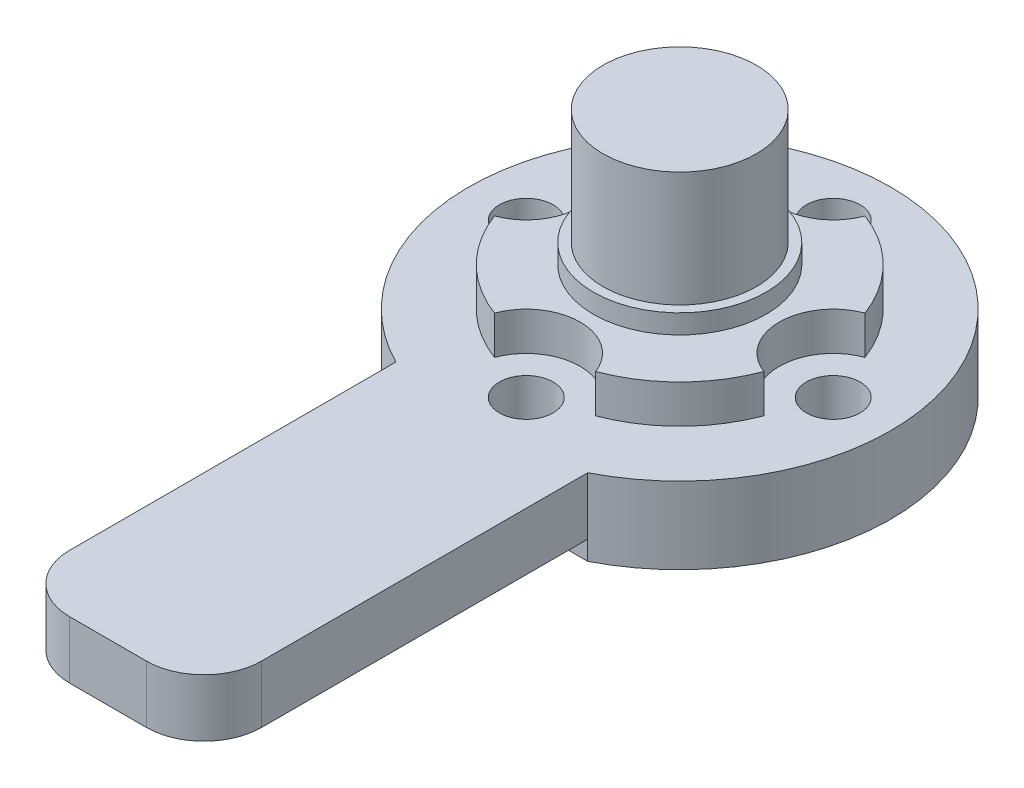
ISO-10303-21;
HEADER;
FILE_DESCRIPTION(('STEP AP214'),'2;1');
FILE_NAME('part.step','',(''),(''),'','','');
FILE_SCHEMA(('AUTOMOTIVE_DESIGN { 1 0 10303 214 1 1 1 1 }'));
ENDSEC;
DATA;
#1=APPLICATION_CONTEXT('core data for automotive mechanical design processes');
#2=APPLICATION_PROTOCOL_DEFINITION('international standard','automotive_design',2000,#1);
#3=PRODUCT_CONTEXT('',#1,'mechanical');
#4=PRODUCT('Part','Part','',(#3));
#5=PRODUCT_RELATED_PRODUCT_CATEGORY('part','',(#4));
#6=PRODUCT_DEFINITION_FORMATION('','',#4);
#7=PRODUCT_DEFINITION_CONTEXT('part definition',#1,'design');
#8=PRODUCT_DEFINITION('design','',#6,#7);
#9=PRODUCT_DEFINITION_SHAPE('','',#8);
#10=(LENGTH_UNIT() NAMED_UNIT(*) SI_UNIT(.MILLI.,.METRE.));
#11=(NAMED_UNIT(*) PLANE_ANGLE_UNIT() SI_UNIT($,.RADIAN.));
#12=(NAMED_UNIT(*) SI_UNIT($,.STERADIAN.) SOLID_ANGLE_UNIT());
#13=UNCERTAINTY_MEASURE_WITH_UNIT(LENGTH_MEASURE(1.E-05),#10,'distance_accuracy_value','');
#14=(GEOMETRIC_REPRESENTATION_CONTEXT(3) GLOBAL_UNCERTAINTY_ASSIGNED_CONTEXT((#13)) GLOBAL_UNIT_ASSIGNED_CONTEXT((#10,
#11,#12)) REPRESENTATION_CONTEXT('',''));
#15=CARTESIAN_POINT('',(0.,0.,0.));
#16=DIRECTION('',(0.,0.,1.));
#17=DIRECTION('',(1.,0.,0.));
#18=AXIS2_PLACEMENT_3D('',#15,#16,#17);
#19=CARTESIAN_POINT('',(0.,4.,0.));
#20=DIRECTION('',(0.,-1.,0.));
#21=DIRECTION('',(0.,0.,-1.));
#22=AXIS2_PLACEMENT_3D('',#19,#20,#21);
#23=CYLINDRICAL_SURFACE('',#22,11.);
#24=DIRECTION('',(0.,-1.,0.));
#25=VECTOR('',#24,1.);
#26=CARTESIAN_POINT('',(5.,26.3606797749979,9.79795897113271));
#27=LINE('',#26,#25);
#28=CARTESIAN_POINT('',(5.,4.,9.79795897113271));
#29=VERTEX_POINT('',#28);
#30=CARTESIAN_POINT('',(5.,1.,9.79795897113271));
#31=VERTEX_POINT('',#30);
#32=EDGE_CURVE('E227',#29,#31,#27,.T.);
#33=ORIENTED_EDGE('',*,*,#32,.T.);
#34=DIRECTION('',(0.,-1.,0.));
#35=VECTOR('',#34,1.);
#36=CARTESIAN_POINT('',(5.,26.3606797749979,9.79795897113271));
#37=LINE('',#36,#35);
#38=CARTESIAN_POINT('',(5.,0.,9.79795897113271));
#39=VERTEX_POINT('',#38);
#40=EDGE_CURVE('E164',#31,#39,#37,.T.);
#41=ORIENTED_EDGE('',*,*,#40,.T.);
#42=CARTESIAN_POINT('',(0.,0.,0.));
#43=DIRECTION('',(0.,1.,0.));
#44=DIRECTION('',(0.,0.,1.));
#45=AXIS2_PLACEMENT_3D('',#42,#43,#44);
#46=CIRCLE('',#45,11.);
#47=CARTESIAN_POINT('',(-5.,0.,9.79795897113271));
#48=VERTEX_POINT('',#47);
#49=EDGE_CURVE('E161',#39,#48,#46,.T.);
#50=ORIENTED_EDGE('',*,*,#49,.T.);
#51=DIRECTION('',(0.,-1.,0.));
#52=VECTOR('',#51,1.);
#53=CARTESIAN_POINT('',(-5.,0.,9.79795897113271));
#54=LINE('',#53,#52);
#55=CARTESIAN_POINT('',(-5.,1.,9.79795897113271));
#56=VERTEX_POINT('',#55);
#57=EDGE_CURVE('E143',#56,#48,#54,.T.);
#58=ORIENTED_EDGE('',*,*,#57,.F.);
#59=DIRECTION('',(0.,-1.,0.));
#60=VECTOR('',#59,1.);
#61=CARTESIAN_POINT('',(-5.,26.3606797749979,9.79795897113271));
#62=LINE('',#61,#60);
#63=CARTESIAN_POINT('',(-5.,4.00000000000001,9.79795897113271));
#64=VERTEX_POINT('',#63);
#65=EDGE_CURVE('E241',#64,#56,#62,.T.);
#66=ORIENTED_EDGE('',*,*,#65,.F.);
#67=CARTESIAN_POINT('',(0.,4.,0.));
#68=DIRECTION('',(0.,1.,0.));
#69=DIRECTION('',(0.,0.,1.));
#70=AXIS2_PLACEMENT_3D('',#67,#68,#69);
#71=CIRCLE('',#70,11.);
#72=EDGE_CURVE('E165',#29,#64,#71,.T.);
#73=ORIENTED_EDGE('',*,*,#72,.F.);
#74=EDGE_LOOP('',(#33,#41,#50,#58,#66,#73));
#75=FACE_BOUND('',#74,.T.);
#76=ADVANCED_FACE('F35',(#75),#23,.T.);
#77=CARTESIAN_POINT('',(0.,13.,0.));
#78=DIRECTION('',(0.,-1.,0.));
#79=DIRECTION('',(0.,0.,-1.));
#80=AXIS2_PLACEMENT_3D('',#77,#78,#79);
#81=CYLINDRICAL_SURFACE('',#80,4.5);
#82=CARTESIAN_POINT('',(0.,6.,0.));
#83=DIRECTION('',(0.,1.,0.));
#84=DIRECTION('',(0.,0.,1.));
#85=AXIS2_PLACEMENT_3D('',#82,#83,#84);
#86=CIRCLE('',#85,4.5);
#87=CARTESIAN_POINT('',(0.,6.,4.5));
#88=VERTEX_POINT('',#87);
#89=EDGE_CURVE('E260',#88,#88,#86,.T.);
#90=ORIENTED_EDGE('',*,*,#89,.T.);
#91=EDGE_LOOP('',(#90));
#92=FACE_BOUND('',#91,.T.);
#93=CARTESIAN_POINT('',(0.,7.,0.));
#94=DIRECTION('',(0.,1.,0.));
#95=DIRECTION('',(0.,0.,1.));
#96=AXIS2_PLACEMENT_3D('',#93,#94,#95);
#97=CIRCLE('',#96,4.5);
#98=CARTESIAN_POINT('',(0.,7.,4.5));
#99=VERTEX_POINT('',#98);
#100=EDGE_CURVE('E255',#99,#99,#97,.T.);
#101=ORIENTED_EDGE('',*,*,#100,.F.);
#102=EDGE_LOOP('',(#101));
#103=FACE_BOUND('',#102,.T.);
#104=ADVANCED_FACE('F338',(#92,#103),#81,.T.);
#105=CARTESIAN_POINT('',(0.,6.,0.));
#106=DIRECTION('',(0.,-1.,0.));
#107=DIRECTION('',(0.,0.,-1.));
#108=AXIS2_PLACEMENT_3D('',#105,#106,#107);
#109=CYLINDRICAL_SURFACE('',#108,7.5);
#110=CARTESIAN_POINT('',(0.,4.,0.));
#111=DIRECTION('',(0.,1.,0.));
#112=DIRECTION('',(0.,0.,1.));
#113=AXIS2_PLACEMENT_3D('',#110,#111,#112);
#114=CIRCLE('',#113,7.5);
#115=CARTESIAN_POINT('',(-7.02171935734293,4.,2.63542354598187));
#116=VERTEX_POINT('',#115);
#117=CARTESIAN_POINT('',(-2.6354235459799,4.,7.02171935734367));
#118=VERTEX_POINT('',#117);
#119=EDGE_CURVE('E169',#116,#118,#114,.T.);
#120=ORIENTED_EDGE('',*,*,#119,.T.);
#121=DIRECTION('',(0.,1.,0.));
#122=VECTOR('',#121,1.);
#123=CARTESIAN_POINT('',(-2.6354235459799,5.,7.02171935734367));
#124=LINE('',#123,#122);
#125=CARTESIAN_POINT('',(-2.6354235459799,6.,7.02171935734367));
#126=VERTEX_POINT('',#125);
#127=EDGE_CURVE('E197',#118,#126,#124,.T.);
#128=ORIENTED_EDGE('',*,*,#127,.T.);
#129=CARTESIAN_POINT('',(0.,6.,0.));
#130=DIRECTION('',(0.,1.,0.));
#131=DIRECTION('',(0.,0.,1.));
#132=AXIS2_PLACEMENT_3D('',#129,#130,#131);
#133=CIRCLE('',#132,7.5);
#134=CARTESIAN_POINT('',(-7.02171935734293,6.,2.63542354598187));
#135=VERTEX_POINT('',#134);
#136=EDGE_CURVE('E403',#135,#126,#133,.T.);
#137=ORIENTED_EDGE('',*,*,#136,.F.);
#138=DIRECTION('',(0.,1.,0.));
#139=VECTOR('',#138,1.);
#140=CARTESIAN_POINT('',(-7.02171935734293,5.,2.63542354598187));
#141=LINE('',#140,#139);
#142=EDGE_CURVE('E188',#135,#116,#141,.F.);
#143=ORIENTED_EDGE('',*,*,#142,.T.);
#144=EDGE_LOOP('',(#120,#128,#137,#143));
#145=FACE_BOUND('',#144,.T.);
#146=ADVANCED_FACE('F334',(#145),#109,.T.);
#147=CARTESIAN_POINT('',(-2.635423545982,4.,-7.02171935734288));
#148=VERTEX_POINT('',#147);
#149=CARTESIAN_POINT('',(-7.02171935734366,4.,-2.6354235459799));
#150=VERTEX_POINT('',#149);
#151=EDGE_CURVE('E289',#148,#150,#114,.T.);
#152=ORIENTED_EDGE('',*,*,#151,.T.);
#153=DIRECTION('',(0.,1.,0.));
#154=VECTOR('',#153,1.);
#155=CARTESIAN_POINT('',(-7.02171935734366,5.,-2.6354235459799));
#156=LINE('',#155,#154);
#157=CARTESIAN_POINT('',(-7.02171935734366,6.,-2.6354235459799));
#158=VERTEX_POINT('',#157);
#159=EDGE_CURVE('E191',#150,#158,#156,.T.);
#160=ORIENTED_EDGE('',*,*,#159,.T.);
#161=CARTESIAN_POINT('',(-2.635423545982,6.,-7.02171935734288));
#162=VERTEX_POINT('',#161);
#163=EDGE_CURVE('E285',#162,#158,#133,.T.);
#164=ORIENTED_EDGE('',*,*,#163,.F.);
#165=DIRECTION('',(0.,1.,0.));
#166=VECTOR('',#165,1.);
#167=CARTESIAN_POINT('',(-2.635423545982,5.,-7.02171935734288));
#168=LINE('',#167,#166);
#169=EDGE_CURVE('E182',#162,#148,#168,.F.);
#170=ORIENTED_EDGE('',*,*,#169,.T.);
#171=EDGE_LOOP('',(#152,#160,#164,#170));
#172=FACE_BOUND('',#171,.T.);
#173=ADVANCED_FACE('F411',(#172),#109,.T.);
#174=CARTESIAN_POINT('',(7.02171935734302,4.,-2.63542354598162));
#175=VERTEX_POINT('',#174);
#176=CARTESIAN_POINT('',(2.63542354598041,4.,-7.02171935734347));
#177=VERTEX_POINT('',#176);
#178=EDGE_CURVE('E179',#175,#177,#114,.T.);
#179=ORIENTED_EDGE('',*,*,#178,.T.);
#180=DIRECTION('',(0.,1.,0.));
#181=VECTOR('',#180,1.);
#182=CARTESIAN_POINT('',(2.63542354598041,5.,-7.02171935734347));
#183=LINE('',#182,#181);
#184=CARTESIAN_POINT('',(2.63542354598041,6.,-7.02171935734347));
#185=VERTEX_POINT('',#184);
#186=EDGE_CURVE('E185',#177,#185,#183,.T.);
#187=ORIENTED_EDGE('',*,*,#186,.T.);
#188=CARTESIAN_POINT('',(7.02171935734302,6.,-2.63542354598162));
#189=VERTEX_POINT('',#188);
#190=EDGE_CURVE('E281',#189,#185,#133,.T.);
#191=ORIENTED_EDGE('',*,*,#190,.F.);
#192=DIRECTION('',(0.,1.,0.));
#193=VECTOR('',#192,1.);
#194=CARTESIAN_POINT('',(7.02171935734302,5.,-2.63542354598162));
#195=LINE('',#194,#193);
#196=EDGE_CURVE('E175',#189,#175,#195,.F.);
#197=ORIENTED_EDGE('',*,*,#196,.T.);
#198=EDGE_LOOP('',(#179,#187,#191,#197));
#199=FACE_BOUND('',#198,.T.);
#200=ADVANCED_FACE('F335',(#199),#109,.T.);
#201=CARTESIAN_POINT('',(0.,4.,0.));
#202=DIRECTION('',(0.,1.,0.));
#203=DIRECTION('',(0.,0.,1.));
#204=AXIS2_PLACEMENT_3D('',#201,#202,#203);
#205=PLANE('',#204);
#206=CARTESIAN_POINT('',(2.63542354598148,4.,7.02171935734307));
#207=VERTEX_POINT('',#206);
#208=CARTESIAN_POINT('',(7.02171935734347,4.,2.63542354598042));
#209=VERTEX_POINT('',#208);
#210=EDGE_CURVE('E280',#207,#209,#114,.T.);
#211=ORIENTED_EDGE('',*,*,#210,.F.);
#212=CARTESIAN_POINT('',(9.01899415695745E-13,4.,8.0000000000009));
#213=DIRECTION('',(0.,1.,0.));
#214=DIRECTION('',(0.,0.,1.));
#215=AXIS2_PLACEMENT_3D('',#212,#213,#214);
#216=CIRCLE('',#215,2.81113683098277);
#217=EDGE_CURVE('E266',#118,#207,#216,.F.);
#218=ORIENTED_EDGE('',*,*,#217,.F.);
#219=ORIENTED_EDGE('',*,*,#119,.F.);
#220=CARTESIAN_POINT('',(-8.00000000000068,4.,1.12265752250111E-12));
#221=DIRECTION('',(0.,1.,0.));
#222=DIRECTION('',(0.,0.,1.));
#223=AXIS2_PLACEMENT_3D('',#220,#221,#222);
#224=CIRCLE('',#223,2.81113683098291);
#225=EDGE_CURVE('E267',#150,#116,#224,.F.);
#226=ORIENTED_EDGE('',*,*,#225,.F.);
#227=ORIENTED_EDGE('',*,*,#151,.F.);
#228=CARTESIAN_POINT('',(-9.02879133135063E-13,4.,-8.00000000000046));
#229=DIRECTION('',(0.,1.,0.));
#230=DIRECTION('',(0.,0.,1.));
#231=AXIS2_PLACEMENT_3D('',#228,#229,#230);
#232=CIRCLE('',#231,2.81113683098317);
#233=EDGE_CURVE('E272',#177,#148,#232,.F.);
#234=ORIENTED_EDGE('',*,*,#233,.F.);
#235=ORIENTED_EDGE('',*,*,#178,.F.);
#236=CARTESIAN_POINT('',(8.00000000000068,4.,-6.81141308890378E-13));
#237=DIRECTION('',(0.,1.,0.));
#238=DIRECTION('',(0.,0.,1.));
#239=AXIS2_PLACEMENT_3D('',#236,#237,#238);
#240=CIRCLE('',#239,2.81113683098305);
#241=EDGE_CURVE('E278',#209,#175,#240,.F.);
#242=ORIENTED_EDGE('',*,*,#241,.F.);
#243=EDGE_LOOP('',(#211,#218,#219,#226,#227,#234,#235,#242));
#244=FACE_BOUND('',#243,.T.);
#245=DIRECTION('',(1.,0.,0.));
#246=VECTOR('',#245,1.);
#247=CARTESIAN_POINT('',(0.,4.,29.7979589711327));
#248=LINE('',#247,#246);
#249=CARTESIAN_POINT('',(-2.,4.,29.7979589711327));
#250=VERTEX_POINT('',#249);
#251=CARTESIAN_POINT('',(2.,4.,29.7979589711327));
#252=VERTEX_POINT('',#251);
#253=EDGE_CURVE('E221',#250,#252,#248,.T.);
#254=ORIENTED_EDGE('',*,*,#253,.T.);
#255=CARTESIAN_POINT('',(2.,4.,26.7979589711327));
#256=DIRECTION('',(0.,1.,0.));
#257=DIRECTION('',(0.,0.,1.));
#258=AXIS2_PLACEMENT_3D('',#255,#256,#257);
#259=CIRCLE('',#258,3.);
#260=CARTESIAN_POINT('',(5.,4.,26.7979589711327));
#261=VERTEX_POINT('',#260);
#262=EDGE_CURVE('E43',#252,#261,#259,.T.);
#263=ORIENTED_EDGE('',*,*,#262,.T.);
#264=DIRECTION('',(0.,0.,-1.));
#265=VECTOR('',#264,1.);
#266=CARTESIAN_POINT('',(5.,4.,0.));
#267=LINE('',#266,#265);
#268=EDGE_CURVE('E219',#261,#29,#267,.T.);
#269=ORIENTED_EDGE('',*,*,#268,.T.);
#270=ORIENTED_EDGE('',*,*,#72,.T.);
#271=DIRECTION('',(0.,0.,-1.));
#272=VECTOR('',#271,1.);
#273=CARTESIAN_POINT('',(-5.,4.,0.));
#274=LINE('',#273,#272);
#275=CARTESIAN_POINT('',(-5.,4.,26.7979589711327));
#276=VERTEX_POINT('',#275);
#277=EDGE_CURVE('E247',#276,#64,#274,.T.);
#278=ORIENTED_EDGE('',*,*,#277,.F.);
#279=CARTESIAN_POINT('',(-2.,4.,26.7979589711327));
#280=DIRECTION('',(0.,1.,0.));
#281=DIRECTION('',(0.,0.,1.));
#282=AXIS2_PLACEMENT_3D('',#279,#280,#281);
#283=CIRCLE('',#282,3.);
#284=EDGE_CURVE('E213',#276,#250,#283,.T.);
#285=ORIENTED_EDGE('',*,*,#284,.T.);
#286=EDGE_LOOP('',(#254,#263,#269,#270,#278,#285));
#287=FACE_BOUND('',#286,.T.);
#288=CARTESIAN_POINT('',(8.00000000000068,4.,-6.81141308890378E-13));
#289=DIRECTION('',(0.,1.,0.));
#290=DIRECTION('',(0.,0.,1.));
#291=AXIS2_PLACEMENT_3D('',#288,#289,#290);
#292=CIRCLE('',#291,1.4000000000008);
#293=CARTESIAN_POINT('',(8.00000000000068,4.,1.40000000000012));
#294=VERTEX_POINT('',#293);
#295=EDGE_CURVE('E294',#294,#294,#292,.T.);
#296=ORIENTED_EDGE('',*,*,#295,.F.);
#297=EDGE_LOOP('',(#296));
#298=FACE_BOUND('',#297,.T.);
#299=CARTESIAN_POINT('',(0.,4.,-8.));
#300=DIRECTION('',(0.,1.,0.));
#301=DIRECTION('',(0.,0.,1.));
#302=AXIS2_PLACEMENT_3D('',#299,#300,#301);
#303=CIRCLE('',#302,1.4);
#304=CARTESIAN_POINT('',(0.,4.,-6.6));
#305=VERTEX_POINT('',#304);
#306=EDGE_CURVE('E293',#305,#305,#303,.T.);
#307=ORIENTED_EDGE('',*,*,#306,.F.);
#308=EDGE_LOOP('',(#307));
#309=FACE_BOUND('',#308,.T.);
#310=CARTESIAN_POINT('',(-7.99999999999932,4.,6.82121026329696E-13));
#311=DIRECTION('',(0.,1.,0.));
#312=DIRECTION('',(0.,0.,1.));
#313=AXIS2_PLACEMENT_3D('',#310,#311,#312);
#314=CIRCLE('',#313,1.40000000000146);
#315=CARTESIAN_POINT('',(-7.99999999999932,4.,1.40000000000214));
#316=VERTEX_POINT('',#315);
#317=EDGE_CURVE('E306',#316,#316,#314,.T.);
#318=ORIENTED_EDGE('',*,*,#317,.F.);
#319=EDGE_LOOP('',(#318));
#320=FACE_BOUND('',#319,.T.);
#321=CARTESIAN_POINT('',(1.36228261778076E-12,4.,8.));
#322=DIRECTION('',(0.,1.,0.));
#323=DIRECTION('',(0.,0.,1.));
#324=AXIS2_PLACEMENT_3D('',#321,#322,#323);
#325=CIRCLE('',#324,1.40000000000193);
#326=CARTESIAN_POINT('',(1.36228261778076E-12,4.,9.40000000000193));
#327=VERTEX_POINT('',#326);
#328=EDGE_CURVE('E300',#327,#327,#325,.T.);
#329=ORIENTED_EDGE('',*,*,#328,.F.);
#330=EDGE_LOOP('',(#329));
#331=FACE_BOUND('',#330,.T.);
#332=ADVANCED_FACE('F217',(#244,#287,#298,#309,#320,#331),#205,.T.);
#333=CARTESIAN_POINT('',(0.,0.,0.));
#334=DIRECTION('',(0.,1.,0.));
#335=DIRECTION('',(0.,0.,1.));
#336=AXIS2_PLACEMENT_3D('',#333,#334,#335);
#337=PLANE('',#336);
#338=CARTESIAN_POINT('',(8.00000000000068,0.,-6.81141308890378E-13));
#339=DIRECTION('',(0.,1.,0.));
#340=DIRECTION('',(0.,0.,1.));
#341=AXIS2_PLACEMENT_3D('',#338,#339,#340);
#342=CIRCLE('',#341,1.4000000000008);
#343=CARTESIAN_POINT('',(8.00000000000068,0.,1.40000000000012));
#344=VERTEX_POINT('',#343);
#345=EDGE_CURVE('E290',#344,#344,#342,.T.);
#346=ORIENTED_EDGE('',*,*,#345,.T.);
#347=EDGE_LOOP('',(#346));
#348=FACE_BOUND('',#347,.T.);
#349=CARTESIAN_POINT('',(1.36228261778076E-12,0.,8.));
#350=DIRECTION('',(0.,1.,0.));
#351=DIRECTION('',(0.,0.,1.));
#352=AXIS2_PLACEMENT_3D('',#349,#350,#351);
#353=CIRCLE('',#352,1.40000000000193);
#354=CARTESIAN_POINT('',(1.36228261778076E-12,0.,9.40000000000193));
#355=VERTEX_POINT('',#354);
#356=EDGE_CURVE('E297',#355,#355,#353,.T.);
#357=ORIENTED_EDGE('',*,*,#356,.T.);
#358=EDGE_LOOP('',(#357));
#359=FACE_BOUND('',#358,.T.);
#360=CARTESIAN_POINT('',(-7.99999999999932,0.,6.82121026329696E-13));
#361=DIRECTION('',(0.,1.,0.));
#362=DIRECTION('',(0.,0.,1.));
#363=AXIS2_PLACEMENT_3D('',#360,#361,#362);
#364=CIRCLE('',#363,1.40000000000146);
#365=CARTESIAN_POINT('',(-7.99999999999932,0.,1.40000000000214));
#366=VERTEX_POINT('',#365);
#367=EDGE_CURVE('E303',#366,#366,#364,.T.);
#368=ORIENTED_EDGE('',*,*,#367,.T.);
#369=EDGE_LOOP('',(#368));
#370=FACE_BOUND('',#369,.T.);
#371=CARTESIAN_POINT('',(0.,0.,-8.));
#372=DIRECTION('',(0.,1.,0.));
#373=DIRECTION('',(0.,0.,1.));
#374=AXIS2_PLACEMENT_3D('',#371,#372,#373);
#375=CIRCLE('',#374,1.4);
#376=CARTESIAN_POINT('',(0.,0.,-6.6));
#377=VERTEX_POINT('',#376);
#378=EDGE_CURVE('E172',#377,#377,#375,.T.);
#379=ORIENTED_EDGE('',*,*,#378,.T.);
#380=EDGE_LOOP('',(#379));
#381=FACE_BOUND('',#380,.T.);
#382=ORIENTED_EDGE('',*,*,#49,.F.);
#383=DIRECTION('',(-1.,0.,0.));
#384=VECTOR('',#383,1.);
#385=CARTESIAN_POINT('',(11.,0.,9.79795897113271));
#386=LINE('',#385,#384);
#387=EDGE_CURVE('E147',#39,#48,#386,.T.);
#388=ORIENTED_EDGE('',*,*,#387,.T.);
#389=EDGE_LOOP('',(#382,#388));
#390=FACE_BOUND('',#389,.T.);
#391=CARTESIAN_POINT('',(0.,0.,0.));
#392=DIRECTION('',(0.,1.,0.));
#393=DIRECTION('',(0.,0.,1.));
#394=AXIS2_PLACEMENT_3D('',#391,#392,#393);
#395=CIRCLE('',#394,4.25);
#396=CARTESIAN_POINT('',(0.,0.,4.25));
#397=VERTEX_POINT('',#396);
#398=EDGE_CURVE('E166',#397,#397,#395,.T.);
#399=ORIENTED_EDGE('',*,*,#398,.T.);
#400=EDGE_LOOP('',(#399));
#401=FACE_BOUND('',#400,.T.);
#402=ADVANCED_FACE('F159',(#348,#359,#370,#381,#390,#401),#337,.F.);
#403=CARTESIAN_POINT('',(0.,4.,0.));
#404=DIRECTION('',(0.,-1.,0.));
#405=DIRECTION('',(0.,0.,-1.));
#406=AXIS2_PLACEMENT_3D('',#403,#404,#405);
#407=CYLINDRICAL_SURFACE('',#406,4.25);
#408=CARTESIAN_POINT('',(0.,4.,0.));
#409=DIRECTION('',(0.,1.,0.));
#410=DIRECTION('',(0.,0.,1.));
#411=AXIS2_PLACEMENT_3D('',#408,#409,#410);
#412=CIRCLE('',#411,4.25);
#413=CARTESIAN_POINT('',(0.,4.,4.25));
#414=VERTEX_POINT('',#413);
#415=EDGE_CURVE('E284',#414,#414,#412,.T.);
#416=ORIENTED_EDGE('',*,*,#415,.T.);
#417=EDGE_LOOP('',(#416));
#418=FACE_BOUND('',#417,.T.);
#419=ORIENTED_EDGE('',*,*,#398,.F.);
#420=EDGE_LOOP('',(#419));
#421=FACE_BOUND('',#420,.T.);
#422=ADVANCED_FACE('F316',(#418,#421),#407,.F.);
#423=CARTESIAN_POINT('',(0.,0.,-8.));
#424=DIRECTION('',(0.,1.,0.));
#425=DIRECTION('',(0.,0.,1.));
#426=AXIS2_PLACEMENT_3D('',#423,#424,#425);
#427=CYLINDRICAL_SURFACE('',#426,1.4);
#428=ORIENTED_EDGE('',*,*,#378,.F.);
#429=EDGE_LOOP('',(#428));
#430=FACE_BOUND('',#429,.T.);
#431=ORIENTED_EDGE('',*,*,#306,.T.);
#432=EDGE_LOOP('',(#431));
#433=FACE_BOUND('',#432,.T.);
#434=ADVANCED_FACE('F436',(#430,#433),#427,.F.);
#435=CARTESIAN_POINT('',(-7.99999999999932,0.,6.82121026329696E-13));
#436=DIRECTION('',(0.,1.,0.));
#437=DIRECTION('',(0.,0.,1.));
#438=AXIS2_PLACEMENT_3D('',#435,#436,#437);
#439=CYLINDRICAL_SURFACE('',#438,1.40000000000146);
#440=ORIENTED_EDGE('',*,*,#367,.F.);
#441=EDGE_LOOP('',(#440));
#442=FACE_BOUND('',#441,.T.);
#443=ORIENTED_EDGE('',*,*,#317,.T.);
#444=EDGE_LOOP('',(#443));
#445=FACE_BOUND('',#444,.T.);
#446=ADVANCED_FACE('F432',(#442,#445),#439,.F.);
#447=CARTESIAN_POINT('',(1.36228261778076E-12,0.,8.));
#448=DIRECTION('',(0.,1.,0.));
#449=DIRECTION('',(0.,0.,1.));
#450=AXIS2_PLACEMENT_3D('',#447,#448,#449);
#451=CYLINDRICAL_SURFACE('',#450,1.40000000000193);
#452=ORIENTED_EDGE('',*,*,#356,.F.);
#453=EDGE_LOOP('',(#452));
#454=FACE_BOUND('',#453,.T.);
#455=ORIENTED_EDGE('',*,*,#328,.T.);
#456=EDGE_LOOP('',(#455));
#457=FACE_BOUND('',#456,.T.);
#458=ADVANCED_FACE('F392',(#454,#457),#451,.F.);
#459=CARTESIAN_POINT('',(8.00000000000068,0.,-6.81141308890378E-13));
#460=DIRECTION('',(0.,1.,0.));
#461=DIRECTION('',(0.,0.,1.));
#462=AXIS2_PLACEMENT_3D('',#459,#460,#461);
#463=CYLINDRICAL_SURFACE('',#462,1.4000000000008);
#464=ORIENTED_EDGE('',*,*,#345,.F.);
#465=EDGE_LOOP('',(#464));
#466=FACE_BOUND('',#465,.T.);
#467=ORIENTED_EDGE('',*,*,#295,.T.);
#468=EDGE_LOOP('',(#467));
#469=FACE_BOUND('',#468,.T.);
#470=ADVANCED_FACE('F387',(#466,#469),#463,.F.);
#471=CARTESIAN_POINT('',(0.,6.,0.));
#472=DIRECTION('',(0.,1.,0.));
#473=DIRECTION('',(0.,0.,1.));
#474=AXIS2_PLACEMENT_3D('',#471,#472,#473);
#475=PLANE('',#474);
#476=ORIENTED_EDGE('',*,*,#89,.F.);
#477=EDGE_LOOP('',(#476));
#478=FACE_BOUND('',#477,.T.);
#479=CARTESIAN_POINT('',(9.01899415695745E-13,6.,8.0000000000009));
#480=DIRECTION('',(0.,1.,0.));
#481=DIRECTION('',(0.,0.,1.));
#482=AXIS2_PLACEMENT_3D('',#479,#480,#481);
#483=CIRCLE('',#482,2.81113683098277);
#484=CARTESIAN_POINT('',(2.63542354598148,6.,7.02171935734307));
#485=VERTEX_POINT('',#484);
#486=EDGE_CURVE('E264',#485,#126,#483,.T.);
#487=ORIENTED_EDGE('',*,*,#486,.F.);
#488=CARTESIAN_POINT('',(7.02171935734347,6.,2.63542354598042));
#489=VERTEX_POINT('',#488);
#490=EDGE_CURVE('E286',#485,#489,#133,.T.);
#491=ORIENTED_EDGE('',*,*,#490,.T.);
#492=CARTESIAN_POINT('',(8.00000000000068,6.,-6.81141308890378E-13));
#493=DIRECTION('',(0.,1.,0.));
#494=DIRECTION('',(0.,0.,1.));
#495=AXIS2_PLACEMENT_3D('',#492,#493,#494);
#496=CIRCLE('',#495,2.81113683098305);
#497=EDGE_CURVE('E269',#189,#489,#496,.T.);
#498=ORIENTED_EDGE('',*,*,#497,.F.);
#499=ORIENTED_EDGE('',*,*,#190,.T.);
#500=CARTESIAN_POINT('',(-9.02879133135063E-13,6.,-8.00000000000046));
#501=DIRECTION('',(0.,1.,0.));
#502=DIRECTION('',(0.,0.,1.));
#503=AXIS2_PLACEMENT_3D('',#500,#501,#502);
#504=CIRCLE('',#503,2.81113683098317);
#505=EDGE_CURVE('E263',#162,#185,#504,.T.);
#506=ORIENTED_EDGE('',*,*,#505,.F.);
#507=ORIENTED_EDGE('',*,*,#163,.T.);
#508=CARTESIAN_POINT('',(-8.00000000000068,6.,1.12265752250111E-12));
#509=DIRECTION('',(0.,1.,0.));
#510=DIRECTION('',(0.,0.,1.));
#511=AXIS2_PLACEMENT_3D('',#508,#509,#510);
#512=CIRCLE('',#511,2.81113683098291);
#513=EDGE_CURVE('E270',#135,#158,#512,.T.);
#514=ORIENTED_EDGE('',*,*,#513,.F.);
#515=ORIENTED_EDGE('',*,*,#136,.T.);
#516=EDGE_LOOP('',(#487,#491,#498,#499,#506,#507,#514,#515));
#517=FACE_BOUND('',#516,.T.);
#518=ADVANCED_FACE('F331',(#478,#517),#475,.T.);
#519=ORIENTED_EDGE('',*,*,#490,.F.);
#520=DIRECTION('',(0.,1.,0.));
#521=VECTOR('',#520,1.);
#522=CARTESIAN_POINT('',(2.63542354598148,5.,7.02171935734307));
#523=LINE('',#522,#521);
#524=EDGE_CURVE('E194',#485,#207,#523,.F.);
#525=ORIENTED_EDGE('',*,*,#524,.T.);
#526=ORIENTED_EDGE('',*,*,#210,.T.);
#527=DIRECTION('',(0.,1.,0.));
#528=VECTOR('',#527,1.);
#529=CARTESIAN_POINT('',(7.02171935734347,5.,2.63542354598042));
#530=LINE('',#529,#528);
#531=EDGE_CURVE('E178',#209,#489,#530,.T.);
#532=ORIENTED_EDGE('',*,*,#531,.T.);
#533=EDGE_LOOP('',(#519,#525,#526,#532));
#534=FACE_BOUND('',#533,.T.);
#535=ADVANCED_FACE('F322',(#534),#109,.T.);
#536=CARTESIAN_POINT('',(0.,4.,0.));
#537=DIRECTION('',(0.,1.,0.));
#538=DIRECTION('',(0.,0.,1.));
#539=AXIS2_PLACEMENT_3D('',#536,#537,#538);
#540=PLANE('',#539);
#541=ORIENTED_EDGE('',*,*,#415,.F.);
#542=EDGE_LOOP('',(#541));
#543=FACE_BOUND('',#542,.T.);
#544=ADVANCED_FACE('F319',(#543),#540,.F.);
#545=CARTESIAN_POINT('',(8.00000000000068,-3.95109566412585,-6.81141308890378E-13));
#546=DIRECTION('',(0.,1.,0.));
#547=DIRECTION('',(0.,0.,1.));
#548=AXIS2_PLACEMENT_3D('',#545,#546,#547);
#549=CYLINDRICAL_SURFACE('',#548,2.81113683098305);
#550=ORIENTED_EDGE('',*,*,#241,.T.);
#551=ORIENTED_EDGE('',*,*,#196,.F.);
#552=ORIENTED_EDGE('',*,*,#497,.T.);
#553=ORIENTED_EDGE('',*,*,#531,.F.);
#554=EDGE_LOOP('',(#550,#551,#552,#553));
#555=FACE_BOUND('',#554,.T.);
#556=ADVANCED_FACE('F321',(#555),#549,.F.);
#557=CARTESIAN_POINT('',(-9.02879133135063E-13,-3.95109566412585,-8.00000000000046));
#558=DIRECTION('',(0.,1.,0.));
#559=DIRECTION('',(0.,0.,1.));
#560=AXIS2_PLACEMENT_3D('',#557,#558,#559);
#561=CYLINDRICAL_SURFACE('',#560,2.81113683098317);
#562=ORIENTED_EDGE('',*,*,#233,.T.);
#563=ORIENTED_EDGE('',*,*,#169,.F.);
#564=ORIENTED_EDGE('',*,*,#505,.T.);
#565=ORIENTED_EDGE('',*,*,#186,.F.);
#566=EDGE_LOOP('',(#562,#563,#564,#565));
#567=FACE_BOUND('',#566,.T.);
#568=ADVANCED_FACE('F328',(#567),#561,.F.);
#569=CARTESIAN_POINT('',(-8.00000000000068,-3.95109566412585,1.12265752250111E-12));
#570=DIRECTION('',(0.,1.,0.));
#571=DIRECTION('',(0.,0.,1.));
#572=AXIS2_PLACEMENT_3D('',#569,#570,#571);
#573=CYLINDRICAL_SURFACE('',#572,2.81113683098291);
#574=ORIENTED_EDGE('',*,*,#225,.T.);
#575=ORIENTED_EDGE('',*,*,#142,.F.);
#576=ORIENTED_EDGE('',*,*,#513,.T.);
#577=ORIENTED_EDGE('',*,*,#159,.F.);
#578=EDGE_LOOP('',(#574,#575,#576,#577));
#579=FACE_BOUND('',#578,.T.);
#580=ADVANCED_FACE('F379',(#579),#573,.F.);
#581=CARTESIAN_POINT('',(9.01899415695745E-13,-3.95109566412585,8.0000000000009));
#582=DIRECTION('',(0.,1.,0.));
#583=DIRECTION('',(0.,0.,1.));
#584=AXIS2_PLACEMENT_3D('',#581,#582,#583);
#585=CYLINDRICAL_SURFACE('',#584,2.81113683098277);
#586=ORIENTED_EDGE('',*,*,#217,.T.);
#587=ORIENTED_EDGE('',*,*,#524,.F.);
#588=ORIENTED_EDGE('',*,*,#486,.T.);
#589=ORIENTED_EDGE('',*,*,#127,.F.);
#590=EDGE_LOOP('',(#586,#587,#588,#589));
#591=FACE_BOUND('',#590,.T.);
#592=ADVANCED_FACE('F372',(#591),#585,.F.);
#593=CARTESIAN_POINT('',(0.,7.,0.));
#594=DIRECTION('',(0.,1.,0.));
#595=DIRECTION('',(0.,0.,1.));
#596=AXIS2_PLACEMENT_3D('',#593,#594,#595);
#597=PLANE('',#596);
#598=CARTESIAN_POINT('',(0.,7.,0.));
#599=DIRECTION('',(0.,1.,0.));
#600=DIRECTION('',(0.,0.,1.));
#601=AXIS2_PLACEMENT_3D('',#598,#599,#600);
#602=CIRCLE('',#601,4.);
#603=CARTESIAN_POINT('',(0.,7.,4.));
#604=VERTEX_POINT('',#603);
#605=EDGE_CURVE('E252',#604,#604,#602,.T.);
#606=ORIENTED_EDGE('',*,*,#605,.F.);
#607=EDGE_LOOP('',(#606));
#608=FACE_BOUND('',#607,.T.);
#609=ORIENTED_EDGE('',*,*,#100,.T.);
#610=EDGE_LOOP('',(#609));
#611=FACE_BOUND('',#610,.T.);
#612=ADVANCED_FACE('F368',(#608,#611),#597,.T.);
#613=CARTESIAN_POINT('',(0.,7.,0.));
#614=DIRECTION('',(0.,1.,0.));
#615=DIRECTION('',(0.,0.,1.));
#616=AXIS2_PLACEMENT_3D('',#613,#614,#615);
#617=CYLINDRICAL_SURFACE('',#616,4.);
#618=ORIENTED_EDGE('',*,*,#605,.T.);
#619=EDGE_LOOP('',(#618));
#620=FACE_BOUND('',#619,.T.);
#621=CARTESIAN_POINT('',(0.,13.,0.));
#622=DIRECTION('',(0.,1.,0.));
#623=DIRECTION('',(0.,0.,1.));
#624=AXIS2_PLACEMENT_3D('',#621,#622,#623);
#625=CIRCLE('',#624,4.);
#626=CARTESIAN_POINT('',(0.,13.,4.));
#627=VERTEX_POINT('',#626);
#628=EDGE_CURVE('E229',#627,#627,#625,.T.);
#629=ORIENTED_EDGE('',*,*,#628,.F.);
#630=EDGE_LOOP('',(#629));
#631=FACE_BOUND('',#630,.T.);
#632=ADVANCED_FACE('F365',(#620,#631),#617,.T.);
#633=CARTESIAN_POINT('',(0.,13.,0.));
#634=DIRECTION('',(0.,1.,0.));
#635=DIRECTION('',(0.,0.,1.));
#636=AXIS2_PLACEMENT_3D('',#633,#634,#635);
#637=PLANE('',#636);
#638=ORIENTED_EDGE('',*,*,#628,.T.);
#639=EDGE_LOOP('',(#638));
#640=FACE_BOUND('',#639,.T.);
#641=ADVANCED_FACE('F364',(#640),#637,.T.);
#642=CARTESIAN_POINT('',(5.,26.3606797749979,0.));
#643=DIRECTION('',(-1.,0.,0.));
#644=DIRECTION('',(0.,0.,1.));
#645=AXIS2_PLACEMENT_3D('',#642,#643,#644);
#646=PLANE('',#645);
#647=ORIENTED_EDGE('',*,*,#268,.F.);
#648=DIRECTION('',(0.,-1.,0.));
#649=VECTOR('',#648,1.);
#650=CARTESIAN_POINT('',(5.,26.3606797749979,26.7979589711327));
#651=LINE('',#650,#649);
#652=CARTESIAN_POINT('',(5.,1.,26.7979589711327));
#653=VERTEX_POINT('',#652);
#654=EDGE_CURVE('E202',#261,#653,#651,.T.);
#655=ORIENTED_EDGE('',*,*,#654,.T.);
#656=DIRECTION('',(0.,0.,-1.));
#657=VECTOR('',#656,1.);
#658=CARTESIAN_POINT('',(5.,1.,0.));
#659=LINE('',#658,#657);
#660=EDGE_CURVE('E235',#653,#31,#659,.T.);
#661=ORIENTED_EDGE('',*,*,#660,.T.);
#662=ORIENTED_EDGE('',*,*,#32,.F.);
#663=EDGE_LOOP('',(#647,#655,#661,#662));
#664=FACE_BOUND('',#663,.T.);
#665=ADVANCED_FACE('F225',(#664),#646,.F.);
#666=CARTESIAN_POINT('',(-5.,26.3606797749979,0.));
#667=DIRECTION('',(-1.,0.,0.));
#668=DIRECTION('',(0.,0.,1.));
#669=AXIS2_PLACEMENT_3D('',#666,#667,#668);
#670=PLANE('',#669);
#671=DIRECTION('',(0.,0.,-1.));
#672=VECTOR('',#671,1.);
#673=CARTESIAN_POINT('',(-5.,1.,9.79795897113271));
#674=LINE('',#673,#672);
#675=CARTESIAN_POINT('',(-5.,1.,26.7979589711327));
#676=VERTEX_POINT('',#675);
#677=EDGE_CURVE('E155',#676,#56,#674,.T.);
#678=ORIENTED_EDGE('',*,*,#677,.F.);
#679=DIRECTION('',(0.,-1.,0.));
#680=VECTOR('',#679,1.);
#681=CARTESIAN_POINT('',(-5.,4.00000000000001,26.7979589711327));
#682=LINE('',#681,#680);
#683=EDGE_CURVE('E11',#676,#276,#682,.F.);
#684=ORIENTED_EDGE('',*,*,#683,.T.);
#685=ORIENTED_EDGE('',*,*,#277,.T.);
#686=ORIENTED_EDGE('',*,*,#65,.T.);
#687=EDGE_LOOP('',(#678,#684,#685,#686));
#688=FACE_BOUND('',#687,.T.);
#689=ADVANCED_FACE('F240',(#688),#670,.T.);
#690=CARTESIAN_POINT('',(0.,26.3606797749979,29.7979589711327));
#691=DIRECTION('',(0.,0.,-1.));
#692=DIRECTION('',(-1.,0.,0.));
#693=AXIS2_PLACEMENT_3D('',#690,#691,#692);
#694=PLANE('',#693);
#695=DIRECTION('',(1.,0.,0.));
#696=VECTOR('',#695,1.);
#697=CARTESIAN_POINT('',(0.,1.,29.7979589711327));
#698=LINE('',#697,#696);
#699=CARTESIAN_POINT('',(-2.,1.,29.7979589711327));
#700=VERTEX_POINT('',#699);
#701=CARTESIAN_POINT('',(2.,1.,29.7979589711327));
#702=VERTEX_POINT('',#701);
#703=EDGE_CURVE('E200',#700,#702,#698,.T.);
#704=ORIENTED_EDGE('',*,*,#703,.T.);
#705=DIRECTION('',(0.,-1.,0.));
#706=VECTOR('',#705,1.);
#707=CARTESIAN_POINT('',(2.,26.3606797749979,29.7979589711327));
#708=LINE('',#707,#706);
#709=EDGE_CURVE('E56',#702,#252,#708,.F.);
#710=ORIENTED_EDGE('',*,*,#709,.T.);
#711=ORIENTED_EDGE('',*,*,#253,.F.);
#712=DIRECTION('',(0.,-1.,0.));
#713=VECTOR('',#712,1.);
#714=CARTESIAN_POINT('',(-2.,1.,29.7979589711327));
#715=LINE('',#714,#713);
#716=EDGE_CURVE('E209',#250,#700,#715,.T.);
#717=ORIENTED_EDGE('',*,*,#716,.T.);
#718=EDGE_LOOP('',(#704,#710,#711,#717));
#719=FACE_BOUND('',#718,.T.);
#720=ADVANCED_FACE('F236',(#719),#694,.F.);
#721=CARTESIAN_POINT('',(11.,0.,9.79795897113271));
#722=DIRECTION('',(0.,0.,-1.));
#723=DIRECTION('',(-1.,0.,0.));
#724=AXIS2_PLACEMENT_3D('',#721,#722,#723);
#725=PLANE('',#724);
#726=DIRECTION('',(-1.,0.,0.));
#727=VECTOR('',#726,1.);
#728=CARTESIAN_POINT('',(11.,1.,9.79795897113271));
#729=LINE('',#728,#727);
#730=EDGE_CURVE('E150',#31,#56,#729,.T.);
#731=ORIENTED_EDGE('',*,*,#730,.T.);
#732=ORIENTED_EDGE('',*,*,#57,.T.);
#733=ORIENTED_EDGE('',*,*,#387,.F.);
#734=ORIENTED_EDGE('',*,*,#40,.F.);
#735=EDGE_LOOP('',(#731,#732,#733,#734));
#736=FACE_BOUND('',#735,.T.);
#737=ADVANCED_FACE('F145',(#736),#725,.F.);
#738=CARTESIAN_POINT('',(11.,1.,9.79795897113271));
#739=DIRECTION('',(0.,1.,0.));
#740=DIRECTION('',(0.,0.,1.));
#741=AXIS2_PLACEMENT_3D('',#738,#739,#740);
#742=PLANE('',#741);
#743=ORIENTED_EDGE('',*,*,#660,.F.);
#744=CARTESIAN_POINT('',(2.,1.,26.7979589711327));
#745=DIRECTION('',(0.,1.,0.));
#746=DIRECTION('',(0.,0.,1.));
#747=AXIS2_PLACEMENT_3D('',#744,#745,#746);
#748=CIRCLE('',#747,3.);
#749=EDGE_CURVE('E207',#653,#702,#748,.F.);
#750=ORIENTED_EDGE('',*,*,#749,.T.);
#751=ORIENTED_EDGE('',*,*,#703,.F.);
#752=CARTESIAN_POINT('',(-2.,1.,26.7979589711327));
#753=DIRECTION('',(0.,1.,0.));
#754=DIRECTION('',(0.,0.,1.));
#755=AXIS2_PLACEMENT_3D('',#752,#753,#754);
#756=CIRCLE('',#755,3.);
#757=EDGE_CURVE('E205',#700,#676,#756,.F.);
#758=ORIENTED_EDGE('',*,*,#757,.T.);
#759=ORIENTED_EDGE('',*,*,#677,.T.);
#760=ORIENTED_EDGE('',*,*,#730,.F.);
#761=EDGE_LOOP('',(#743,#750,#751,#758,#759,#760));
#762=FACE_BOUND('',#761,.T.);
#763=ADVANCED_FACE('F234',(#762),#742,.F.);
#764=CARTESIAN_POINT('',(2.,26.3606797749979,26.7979589711327));
#765=DIRECTION('',(0.,-1.,0.));
#766=DIRECTION('',(0.,0.,-1.));
#767=AXIS2_PLACEMENT_3D('',#764,#765,#766);
#768=CYLINDRICAL_SURFACE('',#767,3.);
#769=ORIENTED_EDGE('',*,*,#262,.F.);
#770=ORIENTED_EDGE('',*,*,#709,.F.);
#771=ORIENTED_EDGE('',*,*,#749,.F.);
#772=ORIENTED_EDGE('',*,*,#654,.F.);
#773=EDGE_LOOP('',(#769,#770,#771,#772));
#774=FACE_BOUND('',#773,.T.);
#775=ADVANCED_FACE('F231',(#774),#768,.T.);
#776=CARTESIAN_POINT('',(-2.,26.3606797749979,26.7979589711327));
#777=DIRECTION('',(0.,1.,0.));
#778=DIRECTION('',(0.,0.,1.));
#779=AXIS2_PLACEMENT_3D('',#776,#777,#778);
#780=CYLINDRICAL_SURFACE('',#779,3.);
#781=ORIENTED_EDGE('',*,*,#284,.F.);
#782=ORIENTED_EDGE('',*,*,#683,.F.);
#783=ORIENTED_EDGE('',*,*,#757,.F.);
#784=ORIENTED_EDGE('',*,*,#716,.F.);
#785=EDGE_LOOP('',(#781,#782,#783,#784));
#786=FACE_BOUND('',#785,.T.);
#787=ADVANCED_FACE('F37',(#786),#780,.T.);
#788=CLOSED_SHELL('',(#76,#104,#146,#173,#200,#332,#402,#422,#434,#446,#458,#470,#518,#535,#544,
#556,#568,#580,#592,#612,#632,#641,#665,#689,#720,#737,#763,#775,#787));
#789=MANIFOLD_SOLID_BREP('B2',#788);
#790=ADVANCED_BREP_SHAPE_REPRESENTATION('',(#18,#789),#14);
#791=SHAPE_DEFINITION_REPRESENTATION(#9,#790);
ENDSEC;
END-ISO-10303-21;
